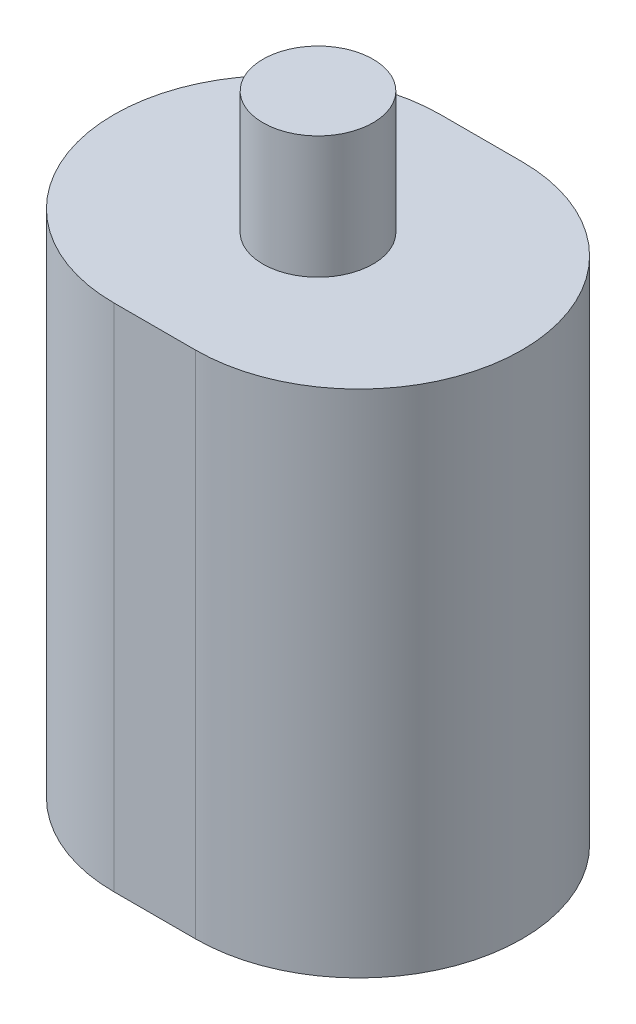
ISO-10303-21;
HEADER;
FILE_DESCRIPTION(('STEP AP214'),'2;1');
FILE_NAME('part.step','',(''),(''),'','','');
FILE_SCHEMA(('AUTOMOTIVE_DESIGN { 1 0 10303 214 1 1 1 1 }'));
ENDSEC;
DATA;
#1=APPLICATION_CONTEXT('core data for automotive mechanical design processes');
#2=APPLICATION_PROTOCOL_DEFINITION('international standard','automotive_design',2000,#1);
#3=PRODUCT_CONTEXT('',#1,'mechanical');
#4=PRODUCT('Part','Part','',(#3));
#5=PRODUCT_RELATED_PRODUCT_CATEGORY('part','',(#4));
#6=PRODUCT_DEFINITION_FORMATION('','',#4);
#7=PRODUCT_DEFINITION_CONTEXT('part definition',#1,'design');
#8=PRODUCT_DEFINITION('design','',#6,#7);
#9=PRODUCT_DEFINITION_SHAPE('','',#8);
#10=(LENGTH_UNIT() NAMED_UNIT(*) SI_UNIT(.MILLI.,.METRE.));
#11=(NAMED_UNIT(*) PLANE_ANGLE_UNIT() SI_UNIT($,.RADIAN.));
#12=(NAMED_UNIT(*) SI_UNIT($,.STERADIAN.) SOLID_ANGLE_UNIT());
#13=UNCERTAINTY_MEASURE_WITH_UNIT(LENGTH_MEASURE(1.E-05),#10,'distance_accuracy_value','');
#14=(GEOMETRIC_REPRESENTATION_CONTEXT(3) GLOBAL_UNCERTAINTY_ASSIGNED_CONTEXT((#13)) GLOBAL_UNIT_ASSIGNED_CONTEXT((#10,
#11,#12)) REPRESENTATION_CONTEXT('',''));
#15=CARTESIAN_POINT('',(0.,0.,0.));
#16=DIRECTION('',(0.,0.,1.));
#17=DIRECTION('',(1.,0.,0.));
#18=AXIS2_PLACEMENT_3D('',#15,#16,#17);
#19=CARTESIAN_POINT('',(0.,12.5,0.));
#20=DIRECTION('',(0.,0.,-1.));
#21=DIRECTION('',(-1.,0.,0.));
#22=AXIS2_PLACEMENT_3D('',#19,#20,#21);
#23=PLANE('',#22);
#24=DIRECTION('',(1.,0.,0.));
#25=VECTOR('',#24,1.);
#26=CARTESIAN_POINT('',(0.,0.,0.));
#27=LINE('',#26,#25);
#28=CARTESIAN_POINT('',(4.,0.,0.));
#29=VERTEX_POINT('',#28);
#30=CARTESIAN_POINT('',(6.,0.,0.));
#31=VERTEX_POINT('',#30);
#32=EDGE_CURVE('E110',#29,#31,#27,.T.);
#33=ORIENTED_EDGE('',*,*,#32,.T.);
#34=DIRECTION('',(0.,-1.,0.));
#35=VECTOR('',#34,1.);
#36=CARTESIAN_POINT('',(6.,12.5,0.));
#37=LINE('',#36,#35);
#38=CARTESIAN_POINT('',(6.,12.5,0.));
#39=VERTEX_POINT('',#38);
#40=EDGE_CURVE('E42',#39,#31,#37,.T.);
#41=ORIENTED_EDGE('',*,*,#40,.F.);
#42=DIRECTION('',(1.,0.,0.));
#43=VECTOR('',#42,1.);
#44=CARTESIAN_POINT('',(0.,12.5,0.));
#45=LINE('',#44,#43);
#46=CARTESIAN_POINT('',(4.,12.5,0.));
#47=VERTEX_POINT('',#46);
#48=EDGE_CURVE('E91',#47,#39,#45,.T.);
#49=ORIENTED_EDGE('',*,*,#48,.F.);
#50=DIRECTION('',(0.,-1.,0.));
#51=VECTOR('',#50,1.);
#52=CARTESIAN_POINT('',(4.,12.5,0.));
#53=LINE('',#52,#51);
#54=EDGE_CURVE('E57',#47,#29,#53,.T.);
#55=ORIENTED_EDGE('',*,*,#54,.T.);
#56=EDGE_LOOP('',(#33,#41,#49,#55));
#57=FACE_BOUND('',#56,.T.);
#58=ADVANCED_FACE('F39',(#57),#23,.F.);
#59=CARTESIAN_POINT('',(6.,12.5,-4.));
#60=DIRECTION('',(0.,-1.,0.));
#61=DIRECTION('',(0.,0.,-1.));
#62=AXIS2_PLACEMENT_3D('',#59,#60,#61);
#63=CYLINDRICAL_SURFACE('',#62,4.);
#64=CARTESIAN_POINT('',(6.,0.,-4.));
#65=DIRECTION('',(0.,1.,0.));
#66=DIRECTION('',(0.,0.,1.));
#67=AXIS2_PLACEMENT_3D('',#64,#65,#66);
#68=CIRCLE('',#67,4.);
#69=CARTESIAN_POINT('',(6.,0.,-8.));
#70=VERTEX_POINT('',#69);
#71=EDGE_CURVE('E98',#31,#70,#68,.T.);
#72=ORIENTED_EDGE('',*,*,#71,.T.);
#73=DIRECTION('',(0.,-1.,0.));
#74=VECTOR('',#73,1.);
#75=CARTESIAN_POINT('',(6.,12.5,-8.));
#76=LINE('',#75,#74);
#77=CARTESIAN_POINT('',(6.,12.5,-8.));
#78=VERTEX_POINT('',#77);
#79=EDGE_CURVE('E96',#78,#70,#76,.T.);
#80=ORIENTED_EDGE('',*,*,#79,.F.);
#81=CARTESIAN_POINT('',(6.,12.5,-4.));
#82=DIRECTION('',(0.,1.,0.));
#83=DIRECTION('',(0.,0.,1.));
#84=AXIS2_PLACEMENT_3D('',#81,#82,#83);
#85=CIRCLE('',#84,4.);
#86=EDGE_CURVE('E83',#39,#78,#85,.T.);
#87=ORIENTED_EDGE('',*,*,#86,.F.);
#88=ORIENTED_EDGE('',*,*,#40,.T.);
#89=EDGE_LOOP('',(#72,#80,#87,#88));
#90=FACE_BOUND('',#89,.T.);
#91=ADVANCED_FACE('F97',(#90),#63,.T.);
#92=CARTESIAN_POINT('',(0.,12.5,-8.));
#93=DIRECTION('',(0.,0.,-1.));
#94=DIRECTION('',(-1.,0.,0.));
#95=AXIS2_PLACEMENT_3D('',#92,#93,#94);
#96=PLANE('',#95);
#97=DIRECTION('',(1.,0.,0.));
#98=VECTOR('',#97,1.);
#99=CARTESIAN_POINT('',(0.,0.,-8.));
#100=LINE('',#99,#98);
#101=CARTESIAN_POINT('',(4.,0.,-8.));
#102=VERTEX_POINT('',#101);
#103=EDGE_CURVE('E116',#102,#70,#100,.T.);
#104=ORIENTED_EDGE('',*,*,#103,.F.);
#105=DIRECTION('',(0.,-1.,0.));
#106=VECTOR('',#105,1.);
#107=CARTESIAN_POINT('',(4.,12.5,-8.));
#108=LINE('',#107,#106);
#109=CARTESIAN_POINT('',(4.,12.5,-8.));
#110=VERTEX_POINT('',#109);
#111=EDGE_CURVE('E71',#110,#102,#108,.T.);
#112=ORIENTED_EDGE('',*,*,#111,.F.);
#113=DIRECTION('',(1.,0.,0.));
#114=VECTOR('',#113,1.);
#115=CARTESIAN_POINT('',(0.,12.5,-8.));
#116=LINE('',#115,#114);
#117=EDGE_CURVE('E90',#110,#78,#116,.T.);
#118=ORIENTED_EDGE('',*,*,#117,.T.);
#119=ORIENTED_EDGE('',*,*,#79,.T.);
#120=EDGE_LOOP('',(#104,#112,#118,#119));
#121=FACE_BOUND('',#120,.T.);
#122=ADVANCED_FACE('F102',(#121),#96,.T.);
#123=CARTESIAN_POINT('',(4.,12.5,-4.));
#124=DIRECTION('',(0.,-1.,0.));
#125=DIRECTION('',(0.,0.,-1.));
#126=AXIS2_PLACEMENT_3D('',#123,#124,#125);
#127=CYLINDRICAL_SURFACE('',#126,4.);
#128=CARTESIAN_POINT('',(4.,0.,-4.));
#129=DIRECTION('',(0.,1.,0.));
#130=DIRECTION('',(0.,0.,1.));
#131=AXIS2_PLACEMENT_3D('',#128,#129,#130);
#132=CIRCLE('',#131,4.);
#133=EDGE_CURVE('E119',#29,#102,#132,.F.);
#134=ORIENTED_EDGE('',*,*,#133,.F.);
#135=ORIENTED_EDGE('',*,*,#54,.F.);
#136=CARTESIAN_POINT('',(4.,12.5,-4.));
#137=DIRECTION('',(0.,1.,0.));
#138=DIRECTION('',(0.,0.,1.));
#139=AXIS2_PLACEMENT_3D('',#136,#137,#138);
#140=CIRCLE('',#139,4.);
#141=EDGE_CURVE('E104',#47,#110,#140,.F.);
#142=ORIENTED_EDGE('',*,*,#141,.T.);
#143=ORIENTED_EDGE('',*,*,#111,.T.);
#144=EDGE_LOOP('',(#134,#135,#142,#143));
#145=FACE_BOUND('',#144,.T.);
#146=ADVANCED_FACE('F129',(#145),#127,.T.);
#147=CARTESIAN_POINT('',(0.,12.5,0.));
#148=DIRECTION('',(0.,1.,0.));
#149=DIRECTION('',(0.,0.,1.));
#150=AXIS2_PLACEMENT_3D('',#147,#148,#149);
#151=PLANE('',#150);
#152=CARTESIAN_POINT('',(5.,12.5,-4.));
#153=DIRECTION('',(0.,1.,0.));
#154=DIRECTION('',(0.,0.,1.));
#155=AXIS2_PLACEMENT_3D('',#152,#153,#154);
#156=CIRCLE('',#155,1.35);
#157=CARTESIAN_POINT('',(5.,12.5,-2.65));
#158=VERTEX_POINT('',#157);
#159=EDGE_CURVE('E11',#158,#158,#156,.T.);
#160=ORIENTED_EDGE('',*,*,#159,.F.);
#161=EDGE_LOOP('',(#160));
#162=FACE_BOUND('',#161,.T.);
#163=ORIENTED_EDGE('',*,*,#48,.T.);
#164=ORIENTED_EDGE('',*,*,#86,.T.);
#165=ORIENTED_EDGE('',*,*,#117,.F.);
#166=ORIENTED_EDGE('',*,*,#141,.F.);
#167=EDGE_LOOP('',(#163,#164,#165,#166));
#168=FACE_BOUND('',#167,.T.);
#169=ADVANCED_FACE('F87',(#162,#168),#151,.T.);
#170=CARTESIAN_POINT('',(0.,0.,0.));
#171=DIRECTION('',(0.,1.,0.));
#172=DIRECTION('',(0.,0.,1.));
#173=AXIS2_PLACEMENT_3D('',#170,#171,#172);
#174=PLANE('',#173);
#175=ORIENTED_EDGE('',*,*,#32,.F.);
#176=ORIENTED_EDGE('',*,*,#133,.T.);
#177=ORIENTED_EDGE('',*,*,#103,.T.);
#178=ORIENTED_EDGE('',*,*,#71,.F.);
#179=EDGE_LOOP('',(#175,#176,#177,#178));
#180=FACE_BOUND('',#179,.T.);
#181=ADVANCED_FACE('F128',(#180),#174,.F.);
#182=CARTESIAN_POINT('',(5.,15.5,-4.));
#183=DIRECTION('',(0.,-1.,0.));
#184=DIRECTION('',(0.,0.,-1.));
#185=AXIS2_PLACEMENT_3D('',#182,#183,#184);
#186=CYLINDRICAL_SURFACE('',#185,1.35);
#187=CARTESIAN_POINT('',(5.,15.5,-4.));
#188=DIRECTION('',(0.,1.,0.));
#189=DIRECTION('',(0.,0.,1.));
#190=AXIS2_PLACEMENT_3D('',#187,#188,#189);
#191=CIRCLE('',#190,1.35);
#192=CARTESIAN_POINT('',(5.,15.5,-2.65));
#193=VERTEX_POINT('',#192);
#194=EDGE_CURVE('E113',#193,#193,#191,.T.);
#195=ORIENTED_EDGE('',*,*,#194,.F.);
#196=EDGE_LOOP('',(#195));
#197=FACE_BOUND('',#196,.T.);
#198=ORIENTED_EDGE('',*,*,#159,.T.);
#199=EDGE_LOOP('',(#198));
#200=FACE_BOUND('',#199,.T.);
#201=ADVANCED_FACE('F164',(#197,#200),#186,.T.);
#202=CARTESIAN_POINT('',(5.,15.5,-4.));
#203=DIRECTION('',(0.,1.,0.));
#204=DIRECTION('',(0.,0.,1.));
#205=AXIS2_PLACEMENT_3D('',#202,#203,#204);
#206=PLANE('',#205);
#207=ORIENTED_EDGE('',*,*,#194,.T.);
#208=EDGE_LOOP('',(#207));
#209=FACE_BOUND('',#208,.T.);
#210=ADVANCED_FACE('F177',(#209),#206,.T.);
#211=CLOSED_SHELL('',(#58,#91,#122,#146,#169,#181,#201,#210));
#212=MANIFOLD_SOLID_BREP('B2',#211);
#213=ADVANCED_BREP_SHAPE_REPRESENTATION('',(#18,#212),#14);
#214=SHAPE_DEFINITION_REPRESENTATION(#9,#213);
ENDSEC;
END-ISO-10303-21;
